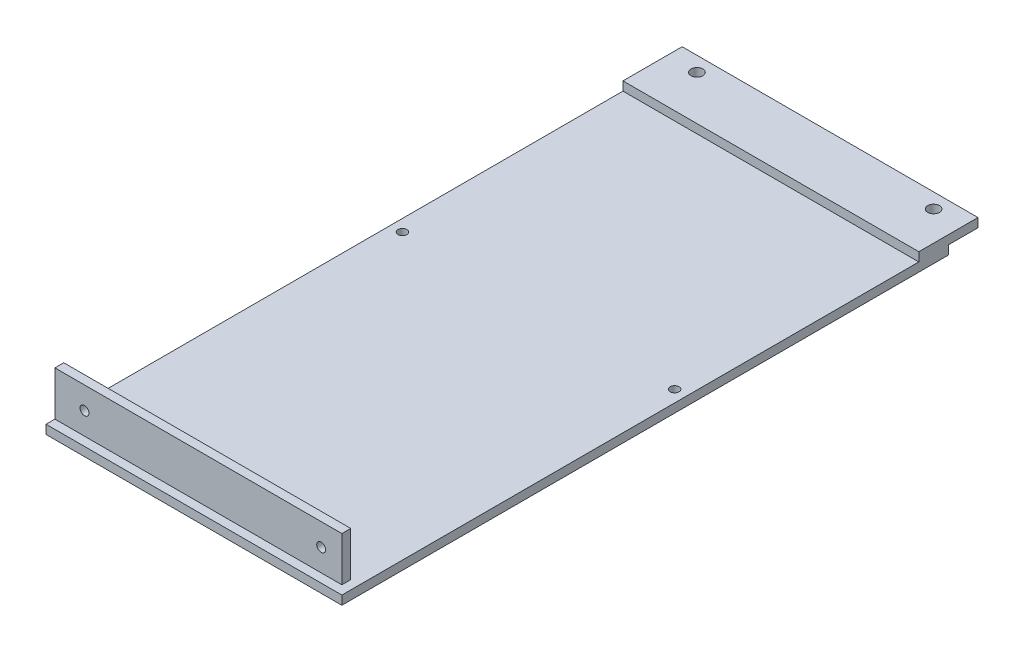
ISO-10303-21;
HEADER;
FILE_DESCRIPTION(('STEP AP214'),'2;1');
FILE_NAME('part.step','',(''),(''),'','','');
FILE_SCHEMA(('AUTOMOTIVE_DESIGN { 1 0 10303 214 1 1 1 1 }'));
ENDSEC;
DATA;
#1=APPLICATION_CONTEXT('core data for automotive mechanical design processes');
#2=APPLICATION_PROTOCOL_DEFINITION('international standard','automotive_design',2000,#1);
#3=PRODUCT_CONTEXT('',#1,'mechanical');
#4=PRODUCT('Part','Part','',(#3));
#5=PRODUCT_RELATED_PRODUCT_CATEGORY('part','',(#4));
#6=PRODUCT_DEFINITION_FORMATION('','',#4);
#7=PRODUCT_DEFINITION_CONTEXT('part definition',#1,'design');
#8=PRODUCT_DEFINITION('design','',#6,#7);
#9=PRODUCT_DEFINITION_SHAPE('','',#8);
#10=(LENGTH_UNIT() NAMED_UNIT(*) SI_UNIT(.MILLI.,.METRE.));
#11=(NAMED_UNIT(*) PLANE_ANGLE_UNIT() SI_UNIT($,.RADIAN.));
#12=(NAMED_UNIT(*) SI_UNIT($,.STERADIAN.) SOLID_ANGLE_UNIT());
#13=UNCERTAINTY_MEASURE_WITH_UNIT(LENGTH_MEASURE(1.E-05),#10,'distance_accuracy_value','');
#14=(GEOMETRIC_REPRESENTATION_CONTEXT(3) GLOBAL_UNCERTAINTY_ASSIGNED_CONTEXT((#13)) GLOBAL_UNIT_ASSIGNED_CONTEXT((#10,
#11,#12)) REPRESENTATION_CONTEXT('',''));
#15=CARTESIAN_POINT('',(0.,0.,0.));
#16=DIRECTION('',(0.,0.,1.));
#17=DIRECTION('',(1.,0.,0.));
#18=AXIS2_PLACEMENT_3D('',#15,#16,#17);
#19=CARTESIAN_POINT('',(-50.,18.,99.5));
#20=DIRECTION('',(0.,0.,-1.));
#21=DIRECTION('',(-1.,0.,0.));
#22=AXIS2_PLACEMENT_3D('',#19,#20,#21);
#23=PLANE('',#22);
#24=CARTESIAN_POINT('',(-40.,10.5,99.5));
#25=DIRECTION('',(0.,0.,1.));
#26=DIRECTION('',(1.,0.,0.));
#27=AXIS2_PLACEMENT_3D('',#24,#25,#26);
#28=CIRCLE('',#27,1.5);
#29=CARTESIAN_POINT('',(-38.5,10.5,99.5));
#30=VERTEX_POINT('',#29);
#31=EDGE_CURVE('E163',#30,#30,#28,.T.);
#32=ORIENTED_EDGE('',*,*,#31,.F.);
#33=EDGE_LOOP('',(#32));
#34=FACE_BOUND('',#33,.T.);
#35=CARTESIAN_POINT('',(40.,10.5,99.5));
#36=DIRECTION('',(0.,0.,1.));
#37=DIRECTION('',(1.,0.,0.));
#38=AXIS2_PLACEMENT_3D('',#35,#36,#37);
#39=CIRCLE('',#38,1.5);
#40=CARTESIAN_POINT('',(41.5,10.5,99.5));
#41=VERTEX_POINT('',#40);
#42=EDGE_CURVE('E559',#41,#41,#39,.T.);
#43=ORIENTED_EDGE('',*,*,#42,.F.);
#44=EDGE_LOOP('',(#43));
#45=FACE_BOUND('',#44,.T.);
#46=DIRECTION('',(0.,-1.,0.));
#47=VECTOR('',#46,1.);
#48=CARTESIAN_POINT('',(47.,18.,99.5));
#49=LINE('',#48,#47);
#50=CARTESIAN_POINT('',(47.,18.,99.5));
#51=VERTEX_POINT('',#50);
#52=CARTESIAN_POINT('',(47.,3.,99.5));
#53=VERTEX_POINT('',#52);
#54=EDGE_CURVE('E143',#51,#53,#49,.T.);
#55=ORIENTED_EDGE('',*,*,#54,.F.);
#56=DIRECTION('',(1.,0.,0.));
#57=VECTOR('',#56,1.);
#58=CARTESIAN_POINT('',(-50.,18.,99.5));
#59=LINE('',#58,#57);
#60=CARTESIAN_POINT('',(-50.,18.,99.5));
#61=VERTEX_POINT('',#60);
#62=EDGE_CURVE('E572',#61,#51,#59,.T.);
#63=ORIENTED_EDGE('',*,*,#62,.F.);
#64=DIRECTION('',(0.,-1.,0.));
#65=VECTOR('',#64,1.);
#66=CARTESIAN_POINT('',(-50.,18.,99.5));
#67=LINE('',#66,#65);
#68=CARTESIAN_POINT('',(-50.,3.,99.5));
#69=VERTEX_POINT('',#68);
#70=EDGE_CURVE('E154',#61,#69,#67,.T.);
#71=ORIENTED_EDGE('',*,*,#70,.T.);
#72=DIRECTION('',(1.,0.,0.));
#73=VECTOR('',#72,1.);
#74=CARTESIAN_POINT('',(-50.,3.,99.5));
#75=LINE('',#74,#73);
#76=EDGE_CURVE('E139',#69,#53,#75,.T.);
#77=ORIENTED_EDGE('',*,*,#76,.T.);
#78=EDGE_LOOP('',(#55,#63,#71,#77));
#79=FACE_BOUND('',#78,.T.);
#80=ADVANCED_FACE('F42',(#34,#45,#79),#23,.F.);
#81=CARTESIAN_POINT('',(-50.,18.,96.5));
#82=DIRECTION('',(0.,0.,1.));
#83=DIRECTION('',(1.,0.,0.));
#84=AXIS2_PLACEMENT_3D('',#81,#82,#83);
#85=PLANE('',#84);
#86=CARTESIAN_POINT('',(-40.,10.5,96.5));
#87=DIRECTION('',(0.,0.,1.));
#88=DIRECTION('',(1.,0.,0.));
#89=AXIS2_PLACEMENT_3D('',#86,#87,#88);
#90=CIRCLE('',#89,1.5);
#91=CARTESIAN_POINT('',(-38.5,10.5,96.5));
#92=VERTEX_POINT('',#91);
#93=EDGE_CURVE('E156',#92,#92,#90,.F.);
#94=ORIENTED_EDGE('',*,*,#93,.F.);
#95=EDGE_LOOP('',(#94));
#96=FACE_BOUND('',#95,.T.);
#97=CARTESIAN_POINT('',(40.,10.5,96.5));
#98=DIRECTION('',(0.,0.,1.));
#99=DIRECTION('',(1.,0.,0.));
#100=AXIS2_PLACEMENT_3D('',#97,#98,#99);
#101=CIRCLE('',#100,1.5);
#102=CARTESIAN_POINT('',(41.5,10.5,96.5));
#103=VERTEX_POINT('',#102);
#104=EDGE_CURVE('E563',#103,#103,#101,.F.);
#105=ORIENTED_EDGE('',*,*,#104,.F.);
#106=EDGE_LOOP('',(#105));
#107=FACE_BOUND('',#106,.T.);
#108=DIRECTION('',(0.,1.,0.));
#109=VECTOR('',#108,1.);
#110=CARTESIAN_POINT('',(47.,18.,96.5));
#111=LINE('',#110,#109);
#112=CARTESIAN_POINT('',(47.,3.,96.5));
#113=VERTEX_POINT('',#112);
#114=CARTESIAN_POINT('',(47.,18.,96.5));
#115=VERTEX_POINT('',#114);
#116=EDGE_CURVE('E58',#113,#115,#111,.T.);
#117=ORIENTED_EDGE('',*,*,#116,.F.);
#118=DIRECTION('',(-1.,0.,0.));
#119=VECTOR('',#118,1.);
#120=CARTESIAN_POINT('',(-50.,3.,96.5));
#121=LINE('',#120,#119);
#122=CARTESIAN_POINT('',(-50.,3.,96.5));
#123=VERTEX_POINT('',#122);
#124=EDGE_CURVE('E141',#113,#123,#121,.T.);
#125=ORIENTED_EDGE('',*,*,#124,.T.);
#126=DIRECTION('',(0.,-1.,0.));
#127=VECTOR('',#126,1.);
#128=CARTESIAN_POINT('',(-50.,18.,96.5));
#129=LINE('',#128,#127);
#130=CARTESIAN_POINT('',(-50.,18.,96.5));
#131=VERTEX_POINT('',#130);
#132=EDGE_CURVE('E169',#131,#123,#129,.T.);
#133=ORIENTED_EDGE('',*,*,#132,.F.);
#134=DIRECTION('',(-1.,0.,0.));
#135=VECTOR('',#134,1.);
#136=CARTESIAN_POINT('',(-50.,18.,96.5));
#137=LINE('',#136,#135);
#138=EDGE_CURVE('E166',#115,#131,#137,.T.);
#139=ORIENTED_EDGE('',*,*,#138,.F.);
#140=EDGE_LOOP('',(#117,#125,#133,#139));
#141=FACE_BOUND('',#140,.T.);
#142=ADVANCED_FACE('F310',(#96,#107,#141),#85,.F.);
#143=CARTESIAN_POINT('',(0.,18.,0.));
#144=DIRECTION('',(0.,-1.,0.));
#145=DIRECTION('',(0.,0.,-1.));
#146=AXIS2_PLACEMENT_3D('',#143,#144,#145);
#147=PLANE('',#146);
#148=DIRECTION('',(0.,0.,1.));
#149=VECTOR('',#148,1.);
#150=CARTESIAN_POINT('',(47.,18.,99.5));
#151=LINE('',#150,#149);
#152=EDGE_CURVE('E147',#115,#51,#151,.T.);
#153=ORIENTED_EDGE('',*,*,#152,.F.);
#154=ORIENTED_EDGE('',*,*,#138,.T.);
#155=DIRECTION('',(0.,0.,1.));
#156=VECTOR('',#155,1.);
#157=CARTESIAN_POINT('',(-50.,18.,99.5));
#158=LINE('',#157,#156);
#159=EDGE_CURVE('E160',#131,#61,#158,.T.);
#160=ORIENTED_EDGE('',*,*,#159,.T.);
#161=ORIENTED_EDGE('',*,*,#62,.T.);
#162=EDGE_LOOP('',(#153,#154,#160,#161));
#163=FACE_BOUND('',#162,.T.);
#164=ADVANCED_FACE('F306',(#163),#147,.F.);
#165=CARTESIAN_POINT('',(0.,3.,0.));
#166=DIRECTION('',(0.,1.,0.));
#167=DIRECTION('',(0.,0.,1.));
#168=AXIS2_PLACEMENT_3D('',#165,#166,#167);
#169=PLANE('',#168);
#170=CARTESIAN_POINT('',(-46.,3.,-13.97));
#171=DIRECTION('',(0.,1.,0.));
#172=DIRECTION('',(0.,0.,1.));
#173=AXIS2_PLACEMENT_3D('',#170,#171,#172);
#174=CIRCLE('',#173,1.5);
#175=CARTESIAN_POINT('',(-46.,3.,-12.47));
#176=VERTEX_POINT('',#175);
#177=EDGE_CURVE('E539',#176,#176,#174,.T.);
#178=ORIENTED_EDGE('',*,*,#177,.F.);
#179=EDGE_LOOP('',(#178));
#180=FACE_BOUND('',#179,.T.);
#181=CARTESIAN_POINT('',(46.,3.,-13.97));
#182=DIRECTION('',(0.,1.,0.));
#183=DIRECTION('',(0.,0.,1.));
#184=AXIS2_PLACEMENT_3D('',#181,#182,#183);
#185=CIRCLE('',#184,1.5);
#186=CARTESIAN_POINT('',(46.,3.,-12.47));
#187=VERTEX_POINT('',#186);
#188=EDGE_CURVE('E545',#187,#187,#185,.T.);
#189=ORIENTED_EDGE('',*,*,#188,.F.);
#190=EDGE_LOOP('',(#189));
#191=FACE_BOUND('',#190,.T.);
#192=DIRECTION('',(0.,0.,-1.));
#193=VECTOR('',#192,1.);
#194=CARTESIAN_POINT('',(-50.,3.,102.5));
#195=LINE('',#194,#193);
#196=CARTESIAN_POINT('',(-50.,3.,-92.4999999999999));
#197=VERTEX_POINT('',#196);
#198=EDGE_CURVE('E66',#123,#197,#195,.T.);
#199=ORIENTED_EDGE('',*,*,#198,.F.);
#200=ORIENTED_EDGE('',*,*,#124,.F.);
#201=DIRECTION('',(0.,0.,-1.));
#202=VECTOR('',#201,1.);
#203=CARTESIAN_POINT('',(47.,3.,99.5));
#204=LINE('',#203,#202);
#205=EDGE_CURVE('E134',#53,#113,#204,.T.);
#206=ORIENTED_EDGE('',*,*,#205,.F.);
#207=ORIENTED_EDGE('',*,*,#76,.F.);
#208=CARTESIAN_POINT('',(-50.,3.,102.5));
#209=VERTEX_POINT('',#208);
#210=EDGE_CURVE('E246',#209,#69,#195,.T.);
#211=ORIENTED_EDGE('',*,*,#210,.F.);
#212=DIRECTION('',(1.,0.,0.));
#213=VECTOR('',#212,1.);
#214=CARTESIAN_POINT('',(-50.,3.,102.5));
#215=LINE('',#214,#213);
#216=CARTESIAN_POINT('',(50.,3.,102.5));
#217=VERTEX_POINT('',#216);
#218=EDGE_CURVE('E234',#209,#217,#215,.T.);
#219=ORIENTED_EDGE('',*,*,#218,.T.);
#220=DIRECTION('',(0.,0.,-1.));
#221=VECTOR('',#220,1.);
#222=CARTESIAN_POINT('',(50.,3.,102.5));
#223=LINE('',#222,#221);
#224=CARTESIAN_POINT('',(50.,3.,-92.5));
#225=VERTEX_POINT('',#224);
#226=EDGE_CURVE('E238',#217,#225,#223,.T.);
#227=ORIENTED_EDGE('',*,*,#226,.T.);
#228=DIRECTION('',(1.,0.,0.));
#229=VECTOR('',#228,1.);
#230=CARTESIAN_POINT('',(-50.,3.,-92.5));
#231=LINE('',#230,#229);
#232=EDGE_CURVE('E209',#197,#225,#231,.T.);
#233=ORIENTED_EDGE('',*,*,#232,.F.);
#234=EDGE_LOOP('',(#199,#200,#206,#207,#211,#219,#227,#233));
#235=FACE_BOUND('',#234,.T.);
#236=ADVANCED_FACE('F136',(#180,#191,#235),#169,.T.);
#237=CARTESIAN_POINT('',(-50.,3.,102.5));
#238=DIRECTION('',(0.,0.,-1.));
#239=DIRECTION('',(-1.,0.,0.));
#240=AXIS2_PLACEMENT_3D('',#237,#238,#239);
#241=PLANE('',#240);
#242=DIRECTION('',(1.,0.,0.));
#243=VECTOR('',#242,1.);
#244=CARTESIAN_POINT('',(-50.,0.,102.5));
#245=LINE('',#244,#243);
#246=CARTESIAN_POINT('',(-50.,0.,102.5));
#247=VERTEX_POINT('',#246);
#248=CARTESIAN_POINT('',(50.,0.,102.5));
#249=VERTEX_POINT('',#248);
#250=EDGE_CURVE('E233',#247,#249,#245,.T.);
#251=ORIENTED_EDGE('',*,*,#250,.T.);
#252=DIRECTION('',(0.,-1.,0.));
#253=VECTOR('',#252,1.);
#254=CARTESIAN_POINT('',(50.,3.,102.5));
#255=LINE('',#254,#253);
#256=EDGE_CURVE('E11',#217,#249,#255,.T.);
#257=ORIENTED_EDGE('',*,*,#256,.F.);
#258=ORIENTED_EDGE('',*,*,#218,.F.);
#259=DIRECTION('',(0.,-1.,0.));
#260=VECTOR('',#259,1.);
#261=CARTESIAN_POINT('',(-50.,3.,102.5));
#262=LINE('',#261,#260);
#263=EDGE_CURVE('E249',#209,#247,#262,.T.);
#264=ORIENTED_EDGE('',*,*,#263,.T.);
#265=EDGE_LOOP('',(#251,#257,#258,#264));
#266=FACE_BOUND('',#265,.T.);
#267=ADVANCED_FACE('F44',(#266),#241,.F.);
#268=CARTESIAN_POINT('',(50.,3.,102.5));
#269=DIRECTION('',(-1.,0.,0.));
#270=DIRECTION('',(0.,0.,1.));
#271=AXIS2_PLACEMENT_3D('',#268,#269,#270);
#272=PLANE('',#271);
#273=DIRECTION('',(0.,-1.,0.));
#274=VECTOR('',#273,1.);
#275=CARTESIAN_POINT('',(50.,6.,-92.5));
#276=LINE('',#275,#274);
#277=CARTESIAN_POINT('',(50.,6.,-92.5));
#278=VERTEX_POINT('',#277);
#279=EDGE_CURVE('E225',#278,#225,#276,.T.);
#280=ORIENTED_EDGE('',*,*,#279,.T.);
#281=ORIENTED_EDGE('',*,*,#226,.F.);
#282=ORIENTED_EDGE('',*,*,#256,.T.);
#283=DIRECTION('',(0.,0.,-1.));
#284=VECTOR('',#283,1.);
#285=CARTESIAN_POINT('',(50.,0.,102.5));
#286=LINE('',#285,#284);
#287=CARTESIAN_POINT('',(50.,0.,-102.5));
#288=VERTEX_POINT('',#287);
#289=EDGE_CURVE('E253',#249,#288,#286,.T.);
#290=ORIENTED_EDGE('',*,*,#289,.T.);
#291=DIRECTION('',(0.,-1.,0.));
#292=VECTOR('',#291,1.);
#293=CARTESIAN_POINT('',(50.,3.,-102.5));
#294=LINE('',#293,#292);
#295=CARTESIAN_POINT('',(50.,3.,-102.5));
#296=VERTEX_POINT('',#295);
#297=EDGE_CURVE('E51',#296,#288,#294,.T.);
#298=ORIENTED_EDGE('',*,*,#297,.F.);
#299=DIRECTION('',(0.,0.,-1.));
#300=VECTOR('',#299,1.);
#301=CARTESIAN_POINT('',(50.,3.,-92.5));
#302=LINE('',#301,#300);
#303=CARTESIAN_POINT('',(50.,3.,-112.5));
#304=VERTEX_POINT('',#303);
#305=EDGE_CURVE('E213',#296,#304,#302,.T.);
#306=ORIENTED_EDGE('',*,*,#305,.T.);
#307=DIRECTION('',(0.,-1.,0.));
#308=VECTOR('',#307,1.);
#309=CARTESIAN_POINT('',(50.,6.,-112.5));
#310=LINE('',#309,#308);
#311=CARTESIAN_POINT('',(50.,6.,-112.5));
#312=VERTEX_POINT('',#311);
#313=EDGE_CURVE('E221',#312,#304,#310,.T.);
#314=ORIENTED_EDGE('',*,*,#313,.F.);
#315=DIRECTION('',(0.,0.,-1.));
#316=VECTOR('',#315,1.);
#317=CARTESIAN_POINT('',(50.,6.,-92.5));
#318=LINE('',#317,#316);
#319=EDGE_CURVE('E199',#278,#312,#318,.T.);
#320=ORIENTED_EDGE('',*,*,#319,.F.);
#321=EDGE_LOOP('',(#280,#281,#282,#290,#298,#306,#314,#320));
#322=FACE_BOUND('',#321,.T.);
#323=ADVANCED_FACE('F275',(#322),#272,.F.);
#324=CARTESIAN_POINT('',(-50.,3.,-102.5));
#325=DIRECTION('',(0.,0.,-1.));
#326=DIRECTION('',(-1.,0.,0.));
#327=AXIS2_PLACEMENT_3D('',#324,#325,#326);
#328=PLANE('',#327);
#329=DIRECTION('',(1.,0.,0.));
#330=VECTOR('',#329,1.);
#331=CARTESIAN_POINT('',(-50.,0.,-102.5));
#332=LINE('',#331,#330);
#333=CARTESIAN_POINT('',(-50.,0.,-102.5));
#334=VERTEX_POINT('',#333);
#335=EDGE_CURVE('E257',#334,#288,#332,.T.);
#336=ORIENTED_EDGE('',*,*,#335,.F.);
#337=DIRECTION('',(0.,-1.,0.));
#338=VECTOR('',#337,1.);
#339=CARTESIAN_POINT('',(-50.,3.,-102.5));
#340=LINE('',#339,#338);
#341=CARTESIAN_POINT('',(-50.,3.,-102.5));
#342=VERTEX_POINT('',#341);
#343=EDGE_CURVE('E266',#342,#334,#340,.T.);
#344=ORIENTED_EDGE('',*,*,#343,.F.);
#345=DIRECTION('',(1.,0.,0.));
#346=VECTOR('',#345,1.);
#347=CARTESIAN_POINT('',(-50.,3.,-102.5));
#348=LINE('',#347,#346);
#349=EDGE_CURVE('E242',#342,#296,#348,.T.);
#350=ORIENTED_EDGE('',*,*,#349,.T.);
#351=ORIENTED_EDGE('',*,*,#297,.T.);
#352=EDGE_LOOP('',(#336,#344,#350,#351));
#353=FACE_BOUND('',#352,.T.);
#354=ADVANCED_FACE('F271',(#353),#328,.T.);
#355=CARTESIAN_POINT('',(-50.,3.,102.5));
#356=DIRECTION('',(-1.,0.,0.));
#357=DIRECTION('',(0.,0.,1.));
#358=AXIS2_PLACEMENT_3D('',#355,#356,#357);
#359=PLANE('',#358);
#360=DIRECTION('',(0.,0.,-1.));
#361=VECTOR('',#360,1.);
#362=CARTESIAN_POINT('',(-50.,0.,102.5));
#363=LINE('',#362,#361);
#364=EDGE_CURVE('E239',#247,#334,#363,.T.);
#365=ORIENTED_EDGE('',*,*,#364,.F.);
#366=ORIENTED_EDGE('',*,*,#263,.F.);
#367=ORIENTED_EDGE('',*,*,#210,.T.);
#368=ORIENTED_EDGE('',*,*,#70,.F.);
#369=ORIENTED_EDGE('',*,*,#159,.F.);
#370=ORIENTED_EDGE('',*,*,#132,.T.);
#371=ORIENTED_EDGE('',*,*,#198,.T.);
#372=DIRECTION('',(0.,-1.,0.));
#373=VECTOR('',#372,1.);
#374=CARTESIAN_POINT('',(-50.,6.,-92.5));
#375=LINE('',#374,#373);
#376=CARTESIAN_POINT('',(-50.,6.,-92.5));
#377=VERTEX_POINT('',#376);
#378=EDGE_CURVE('E229',#377,#197,#375,.T.);
#379=ORIENTED_EDGE('',*,*,#378,.F.);
#380=DIRECTION('',(0.,0.,1.));
#381=VECTOR('',#380,1.);
#382=CARTESIAN_POINT('',(-50.,6.,-92.5));
#383=LINE('',#382,#381);
#384=CARTESIAN_POINT('',(-50.,6.,-112.5));
#385=VERTEX_POINT('',#384);
#386=EDGE_CURVE('E191',#385,#377,#383,.T.);
#387=ORIENTED_EDGE('',*,*,#386,.F.);
#388=DIRECTION('',(0.,-1.,0.));
#389=VECTOR('',#388,1.);
#390=CARTESIAN_POINT('',(-50.,6.,-112.5));
#391=LINE('',#390,#389);
#392=CARTESIAN_POINT('',(-50.,3.,-112.5));
#393=VERTEX_POINT('',#392);
#394=EDGE_CURVE('E205',#385,#393,#391,.T.);
#395=ORIENTED_EDGE('',*,*,#394,.T.);
#396=DIRECTION('',(0.,0.,1.));
#397=VECTOR('',#396,1.);
#398=CARTESIAN_POINT('',(-50.,3.,-92.5));
#399=LINE('',#398,#397);
#400=EDGE_CURVE('E187',#393,#342,#399,.T.);
#401=ORIENTED_EDGE('',*,*,#400,.T.);
#402=ORIENTED_EDGE('',*,*,#343,.T.);
#403=EDGE_LOOP('',(#365,#366,#367,#368,#369,#370,#371,#379,#387,#395,#401,#402));
#404=FACE_BOUND('',#403,.T.);
#405=ADVANCED_FACE('F281',(#404),#359,.T.);
#406=CARTESIAN_POINT('',(0.,0.,0.));
#407=DIRECTION('',(0.,1.,0.));
#408=DIRECTION('',(0.,0.,1.));
#409=AXIS2_PLACEMENT_3D('',#406,#407,#408);
#410=PLANE('',#409);
#411=CARTESIAN_POINT('',(-46.,0.,-13.97));
#412=DIRECTION('',(0.,1.,0.));
#413=DIRECTION('',(0.,0.,1.));
#414=AXIS2_PLACEMENT_3D('',#411,#412,#413);
#415=CIRCLE('',#414,1.5);
#416=CARTESIAN_POINT('',(-46.,0.,-12.47));
#417=VERTEX_POINT('',#416);
#418=EDGE_CURVE('E151',#417,#417,#415,.F.);
#419=ORIENTED_EDGE('',*,*,#418,.F.);
#420=EDGE_LOOP('',(#419));
#421=FACE_BOUND('',#420,.T.);
#422=CARTESIAN_POINT('',(46.,0.,-13.97));
#423=DIRECTION('',(0.,1.,0.));
#424=DIRECTION('',(0.,0.,1.));
#425=AXIS2_PLACEMENT_3D('',#422,#423,#424);
#426=CIRCLE('',#425,1.5);
#427=CARTESIAN_POINT('',(46.,0.,-12.47));
#428=VERTEX_POINT('',#427);
#429=EDGE_CURVE('E548',#428,#428,#426,.F.);
#430=ORIENTED_EDGE('',*,*,#429,.F.);
#431=EDGE_LOOP('',(#430));
#432=FACE_BOUND('',#431,.T.);
#433=ORIENTED_EDGE('',*,*,#250,.F.);
#434=ORIENTED_EDGE('',*,*,#364,.T.);
#435=ORIENTED_EDGE('',*,*,#335,.T.);
#436=ORIENTED_EDGE('',*,*,#289,.F.);
#437=EDGE_LOOP('',(#433,#434,#435,#436));
#438=FACE_BOUND('',#437,.T.);
#439=ADVANCED_FACE('F279',(#421,#432,#438),#410,.F.);
#440=CARTESIAN_POINT('',(0.,3.,0.));
#441=DIRECTION('',(0.,-1.,0.));
#442=DIRECTION('',(0.,0.,-1.));
#443=AXIS2_PLACEMENT_3D('',#440,#441,#442);
#444=PLANE('',#443);
#445=CARTESIAN_POINT('',(40.,3.,-107.5));
#446=DIRECTION('',(0.,-1.,0.));
#447=DIRECTION('',(0.,0.,-1.));
#448=AXIS2_PLACEMENT_3D('',#445,#446,#447);
#449=CIRCLE('',#448,2.);
#450=CARTESIAN_POINT('',(40.,3.,-105.5));
#451=VERTEX_POINT('',#450);
#452=EDGE_CURVE('E174',#451,#451,#449,.F.);
#453=ORIENTED_EDGE('',*,*,#452,.T.);
#454=EDGE_LOOP('',(#453));
#455=FACE_BOUND('',#454,.T.);
#456=CARTESIAN_POINT('',(-40.,3.,-107.5));
#457=DIRECTION('',(0.,-1.,0.));
#458=DIRECTION('',(0.,0.,-1.));
#459=AXIS2_PLACEMENT_3D('',#456,#457,#458);
#460=CIRCLE('',#459,2.);
#461=CARTESIAN_POINT('',(-40.,3.,-105.5));
#462=VERTEX_POINT('',#461);
#463=EDGE_CURVE('E179',#462,#462,#460,.F.);
#464=ORIENTED_EDGE('',*,*,#463,.T.);
#465=EDGE_LOOP('',(#464));
#466=FACE_BOUND('',#465,.T.);
#467=ORIENTED_EDGE('',*,*,#349,.F.);
#468=ORIENTED_EDGE('',*,*,#400,.F.);
#469=DIRECTION('',(-1.,0.,0.));
#470=VECTOR('',#469,1.);
#471=CARTESIAN_POINT('',(-50.,3.,-112.5));
#472=LINE('',#471,#470);
#473=EDGE_CURVE('E196',#304,#393,#472,.T.);
#474=ORIENTED_EDGE('',*,*,#473,.F.);
#475=ORIENTED_EDGE('',*,*,#305,.F.);
#476=EDGE_LOOP('',(#467,#468,#474,#475));
#477=FACE_BOUND('',#476,.T.);
#478=ADVANCED_FACE('F285',(#455,#466,#477),#444,.T.);
#479=CARTESIAN_POINT('',(-50.,6.,-92.5));
#480=DIRECTION('',(0.,0.,-1.));
#481=DIRECTION('',(-1.,0.,0.));
#482=AXIS2_PLACEMENT_3D('',#479,#480,#481);
#483=PLANE('',#482);
#484=ORIENTED_EDGE('',*,*,#232,.T.);
#485=ORIENTED_EDGE('',*,*,#279,.F.);
#486=DIRECTION('',(1.,0.,0.));
#487=VECTOR('',#486,1.);
#488=CARTESIAN_POINT('',(-50.,6.,-92.5));
#489=LINE('',#488,#487);
#490=EDGE_CURVE('E195',#377,#278,#489,.T.);
#491=ORIENTED_EDGE('',*,*,#490,.F.);
#492=ORIENTED_EDGE('',*,*,#378,.T.);
#493=EDGE_LOOP('',(#484,#485,#491,#492));
#494=FACE_BOUND('',#493,.T.);
#495=ADVANCED_FACE('F298',(#494),#483,.F.);
#496=CARTESIAN_POINT('',(-50.,6.,-112.5));
#497=DIRECTION('',(0.,0.,1.));
#498=DIRECTION('',(1.,0.,0.));
#499=AXIS2_PLACEMENT_3D('',#496,#497,#498);
#500=PLANE('',#499);
#501=ORIENTED_EDGE('',*,*,#473,.T.);
#502=ORIENTED_EDGE('',*,*,#394,.F.);
#503=DIRECTION('',(-1.,0.,0.));
#504=VECTOR('',#503,1.);
#505=CARTESIAN_POINT('',(-50.,6.,-112.5));
#506=LINE('',#505,#504);
#507=EDGE_CURVE('E202',#312,#385,#506,.T.);
#508=ORIENTED_EDGE('',*,*,#507,.F.);
#509=ORIENTED_EDGE('',*,*,#313,.T.);
#510=EDGE_LOOP('',(#501,#502,#508,#509));
#511=FACE_BOUND('',#510,.T.);
#512=ADVANCED_FACE('F291',(#511),#500,.F.);
#513=CARTESIAN_POINT('',(0.,6.,0.));
#514=DIRECTION('',(0.,-1.,0.));
#515=DIRECTION('',(0.,0.,-1.));
#516=AXIS2_PLACEMENT_3D('',#513,#514,#515);
#517=PLANE('',#516);
#518=CARTESIAN_POINT('',(40.,6.,-107.5));
#519=DIRECTION('',(0.,1.,0.));
#520=DIRECTION('',(0.,0.,1.));
#521=AXIS2_PLACEMENT_3D('',#518,#519,#520);
#522=CIRCLE('',#521,2.);
#523=CARTESIAN_POINT('',(40.,6.,-105.5));
#524=VERTEX_POINT('',#523);
#525=EDGE_CURVE('E175',#524,#524,#522,.T.);
#526=ORIENTED_EDGE('',*,*,#525,.F.);
#527=EDGE_LOOP('',(#526));
#528=FACE_BOUND('',#527,.T.);
#529=CARTESIAN_POINT('',(-40.,6.,-107.5));
#530=DIRECTION('',(0.,1.,0.));
#531=DIRECTION('',(0.,0.,1.));
#532=AXIS2_PLACEMENT_3D('',#529,#530,#531);
#533=CIRCLE('',#532,2.);
#534=CARTESIAN_POINT('',(-40.,6.,-105.5));
#535=VERTEX_POINT('',#534);
#536=EDGE_CURVE('E183',#535,#535,#533,.T.);
#537=ORIENTED_EDGE('',*,*,#536,.F.);
#538=EDGE_LOOP('',(#537));
#539=FACE_BOUND('',#538,.T.);
#540=ORIENTED_EDGE('',*,*,#386,.T.);
#541=ORIENTED_EDGE('',*,*,#490,.T.);
#542=ORIENTED_EDGE('',*,*,#319,.T.);
#543=ORIENTED_EDGE('',*,*,#507,.T.);
#544=EDGE_LOOP('',(#540,#541,#542,#543));
#545=FACE_BOUND('',#544,.T.);
#546=ADVANCED_FACE('F295',(#528,#539,#545),#517,.F.);
#547=CARTESIAN_POINT('',(-40.,-0.00100000000000013,-107.5));
#548=DIRECTION('',(0.,1.,0.));
#549=DIRECTION('',(0.,0.,1.));
#550=AXIS2_PLACEMENT_3D('',#547,#548,#549);
#551=CYLINDRICAL_SURFACE('',#550,2.);
#552=CARTESIAN_POINT('',(-40.,3.,-105.5));
#553=CARTESIAN_POINT('',(-40.,3.03125,-105.5));
#554=CARTESIAN_POINT('',(-40.,3.0625,-105.5));
#555=CARTESIAN_POINT('',(-40.,3.125,-105.5));
#556=CARTESIAN_POINT('',(-40.,3.15625,-105.5));
#557=CARTESIAN_POINT('',(-40.,3.21875,-105.5));
#558=CARTESIAN_POINT('',(-40.,3.25,-105.5));
#559=CARTESIAN_POINT('',(-40.,3.3125,-105.5));
#560=CARTESIAN_POINT('',(-40.,3.34375,-105.5));
#561=CARTESIAN_POINT('',(-40.,3.40625,-105.5));
#562=CARTESIAN_POINT('',(-40.,3.4375,-105.5));
#563=CARTESIAN_POINT('',(-40.,3.5,-105.5));
#564=CARTESIAN_POINT('',(-40.,3.53125,-105.5));
#565=CARTESIAN_POINT('',(-40.,3.59375,-105.5));
#566=CARTESIAN_POINT('',(-40.,3.625,-105.5));
#567=CARTESIAN_POINT('',(-40.,3.6875,-105.5));
#568=CARTESIAN_POINT('',(-40.,3.71875,-105.5));
#569=CARTESIAN_POINT('',(-40.,3.78125,-105.5));
#570=CARTESIAN_POINT('',(-40.,3.8125,-105.5));
#571=CARTESIAN_POINT('',(-40.,3.875,-105.5));
#572=CARTESIAN_POINT('',(-40.,3.90625,-105.5));
#573=CARTESIAN_POINT('',(-40.,3.96875,-105.5));
#574=CARTESIAN_POINT('',(-40.,4.,-105.5));
#575=CARTESIAN_POINT('',(-40.,4.0625,-105.5));
#576=CARTESIAN_POINT('',(-40.,4.09375,-105.5));
#577=CARTESIAN_POINT('',(-40.,4.15625,-105.5));
#578=CARTESIAN_POINT('',(-40.,4.1875,-105.5));
#579=CARTESIAN_POINT('',(-40.,4.25,-105.5));
#580=CARTESIAN_POINT('',(-40.,4.28125,-105.5));
#581=CARTESIAN_POINT('',(-40.,4.34375,-105.5));
#582=CARTESIAN_POINT('',(-40.,4.375,-105.5));
#583=CARTESIAN_POINT('',(-40.,4.4375,-105.5));
#584=CARTESIAN_POINT('',(-40.,4.46875,-105.5));
#585=CARTESIAN_POINT('',(-40.,4.53125,-105.5));
#586=CARTESIAN_POINT('',(-40.,4.5625,-105.5));
#587=CARTESIAN_POINT('',(-40.,4.625,-105.5));
#588=CARTESIAN_POINT('',(-40.,4.65625,-105.5));
#589=CARTESIAN_POINT('',(-40.,4.71875,-105.5));
#590=CARTESIAN_POINT('',(-40.,4.75,-105.5));
#591=CARTESIAN_POINT('',(-40.,4.8125,-105.5));
#592=CARTESIAN_POINT('',(-40.,4.84375,-105.5));
#593=CARTESIAN_POINT('',(-40.,4.90625,-105.5));
#594=CARTESIAN_POINT('',(-40.,4.9375,-105.5));
#595=CARTESIAN_POINT('',(-40.,5.,-105.5));
#596=CARTESIAN_POINT('',(-40.,5.03125,-105.5));
#597=CARTESIAN_POINT('',(-40.,5.09375,-105.5));
#598=CARTESIAN_POINT('',(-40.,5.125,-105.5));
#599=CARTESIAN_POINT('',(-40.,5.1875,-105.5));
#600=CARTESIAN_POINT('',(-40.,5.21875,-105.5));
#601=CARTESIAN_POINT('',(-40.,5.28125,-105.5));
#602=CARTESIAN_POINT('',(-40.,5.3125,-105.5));
#603=CARTESIAN_POINT('',(-40.,5.375,-105.5));
#604=CARTESIAN_POINT('',(-40.,5.40625,-105.5));
#605=CARTESIAN_POINT('',(-40.,5.46875,-105.5));
#606=CARTESIAN_POINT('',(-40.,5.5,-105.5));
#607=CARTESIAN_POINT('',(-40.,5.5625,-105.5));
#608=CARTESIAN_POINT('',(-40.,5.59375,-105.5));
#609=CARTESIAN_POINT('',(-40.,5.65625,-105.5));
#610=CARTESIAN_POINT('',(-40.,5.6875,-105.5));
#611=CARTESIAN_POINT('',(-40.,5.75,-105.5));
#612=CARTESIAN_POINT('',(-40.,5.78125,-105.5));
#613=CARTESIAN_POINT('',(-40.,5.84375,-105.5));
#614=CARTESIAN_POINT('',(-40.,5.875,-105.5));
#615=CARTESIAN_POINT('',(-40.,5.9375,-105.5));
#616=CARTESIAN_POINT('',(-40.,5.96875,-105.5));
#617=CARTESIAN_POINT('',(-40.,6.,-105.5));
#618=B_SPLINE_CURVE_WITH_KNOTS('',3,(#552,#553,#554,#555,#556,#557,#558,#559,#560,#561,#562,
#563,#564,#565,#566,#567,#568,#569,#570,#571,#572,#573,#574,#575,#576,#577,#578,#579,#580,#581,
#582,#583,#584,#585,#586,#587,#588,#589,#590,#591,#592,#593,#594,#595,#596,#597,#598,#599,#600,
#601,#602,#603,#604,#605,#606,#607,#608,#609,#610,#611,#612,#613,#614,#615,#616,#617),
.UNSPECIFIED.,.F.,.F.,(4,2,2,2,2,2,2,2,2,2,2,2,2,2,2,2,2,2,2,2,2,2,2,2,2,2,2,2,2,2,2,2,4),(0.,
0.0937500000000001,0.1875,0.28125,0.375,0.46875,0.5625,0.65625,0.75,0.84375,0.9375,1.03125,
1.125,1.21875,1.3125,1.40625,1.5,1.59375,1.6875,1.78125,1.875,1.96875,2.0625,2.15625,2.25,
2.34375,2.4375,2.53125,2.625,2.71875,2.8125,2.90625,3.),.UNSPECIFIED.);
#619=EDGE_CURVE('BSEAM327',#462,#535,#618,.T.);
#620=ORIENTED_EDGE('',*,*,#463,.F.);
#621=ORIENTED_EDGE('',*,*,#536,.T.);
#622=ORIENTED_EDGE('',*,*,#619,.T.);
#623=ORIENTED_EDGE('',*,*,#619,.F.);
#624=EDGE_LOOP('',(#620,#622,#621,#623));
#625=FACE_BOUND('',#624,.T.);
#626=ADVANCED_FACE('F327',(#625),#551,.F.);
#627=CARTESIAN_POINT('',(40.,-0.00100000000000013,-107.5));
#628=DIRECTION('',(0.,1.,0.));
#629=DIRECTION('',(0.,0.,1.));
#630=AXIS2_PLACEMENT_3D('',#627,#628,#629);
#631=CYLINDRICAL_SURFACE('',#630,2.);
#632=CARTESIAN_POINT('',(40.,3.,-105.5));
#633=CARTESIAN_POINT('',(40.,3.03125,-105.5));
#634=CARTESIAN_POINT('',(40.,3.0625,-105.5));
#635=CARTESIAN_POINT('',(40.,3.125,-105.5));
#636=CARTESIAN_POINT('',(40.,3.15625,-105.5));
#637=CARTESIAN_POINT('',(40.,3.21875,-105.5));
#638=CARTESIAN_POINT('',(40.,3.25,-105.5));
#639=CARTESIAN_POINT('',(40.,3.3125,-105.5));
#640=CARTESIAN_POINT('',(40.,3.34375,-105.5));
#641=CARTESIAN_POINT('',(40.,3.40625,-105.5));
#642=CARTESIAN_POINT('',(40.,3.4375,-105.5));
#643=CARTESIAN_POINT('',(40.,3.5,-105.5));
#644=CARTESIAN_POINT('',(40.,3.53125,-105.5));
#645=CARTESIAN_POINT('',(40.,3.59375,-105.5));
#646=CARTESIAN_POINT('',(40.,3.625,-105.5));
#647=CARTESIAN_POINT('',(40.,3.6875,-105.5));
#648=CARTESIAN_POINT('',(40.,3.71875,-105.5));
#649=CARTESIAN_POINT('',(40.,3.78125,-105.5));
#650=CARTESIAN_POINT('',(40.,3.8125,-105.5));
#651=CARTESIAN_POINT('',(40.,3.875,-105.5));
#652=CARTESIAN_POINT('',(40.,3.90625,-105.5));
#653=CARTESIAN_POINT('',(40.,3.96875,-105.5));
#654=CARTESIAN_POINT('',(40.,4.,-105.5));
#655=CARTESIAN_POINT('',(40.,4.0625,-105.5));
#656=CARTESIAN_POINT('',(40.,4.09375,-105.5));
#657=CARTESIAN_POINT('',(40.,4.15625,-105.5));
#658=CARTESIAN_POINT('',(40.,4.1875,-105.5));
#659=CARTESIAN_POINT('',(40.,4.25,-105.5));
#660=CARTESIAN_POINT('',(40.,4.28125,-105.5));
#661=CARTESIAN_POINT('',(40.,4.34375,-105.5));
#662=CARTESIAN_POINT('',(40.,4.375,-105.5));
#663=CARTESIAN_POINT('',(40.,4.4375,-105.5));
#664=CARTESIAN_POINT('',(40.,4.46875,-105.5));
#665=CARTESIAN_POINT('',(40.,4.53125,-105.5));
#666=CARTESIAN_POINT('',(40.,4.5625,-105.5));
#667=CARTESIAN_POINT('',(40.,4.625,-105.5));
#668=CARTESIAN_POINT('',(40.,4.65625,-105.5));
#669=CARTESIAN_POINT('',(40.,4.71875,-105.5));
#670=CARTESIAN_POINT('',(40.,4.75,-105.5));
#671=CARTESIAN_POINT('',(40.,4.8125,-105.5));
#672=CARTESIAN_POINT('',(40.,4.84375,-105.5));
#673=CARTESIAN_POINT('',(40.,4.90625,-105.5));
#674=CARTESIAN_POINT('',(40.,4.9375,-105.5));
#675=CARTESIAN_POINT('',(40.,5.,-105.5));
#676=CARTESIAN_POINT('',(40.,5.03125,-105.5));
#677=CARTESIAN_POINT('',(40.,5.09375,-105.5));
#678=CARTESIAN_POINT('',(40.,5.125,-105.5));
#679=CARTESIAN_POINT('',(40.,5.1875,-105.5));
#680=CARTESIAN_POINT('',(40.,5.21875,-105.5));
#681=CARTESIAN_POINT('',(40.,5.28125,-105.5));
#682=CARTESIAN_POINT('',(40.,5.3125,-105.5));
#683=CARTESIAN_POINT('',(40.,5.375,-105.5));
#684=CARTESIAN_POINT('',(40.,5.40625,-105.5));
#685=CARTESIAN_POINT('',(40.,5.46875,-105.5));
#686=CARTESIAN_POINT('',(40.,5.5,-105.5));
#687=CARTESIAN_POINT('',(40.,5.5625,-105.5));
#688=CARTESIAN_POINT('',(40.,5.59375,-105.5));
#689=CARTESIAN_POINT('',(40.,5.65625,-105.5));
#690=CARTESIAN_POINT('',(40.,5.6875,-105.5));
#691=CARTESIAN_POINT('',(40.,5.75,-105.5));
#692=CARTESIAN_POINT('',(40.,5.78125,-105.5));
#693=CARTESIAN_POINT('',(40.,5.84375,-105.5));
#694=CARTESIAN_POINT('',(40.,5.875,-105.5));
#695=CARTESIAN_POINT('',(40.,5.9375,-105.5));
#696=CARTESIAN_POINT('',(40.,5.96875,-105.5));
#697=CARTESIAN_POINT('',(40.,6.,-105.5));
#698=B_SPLINE_CURVE_WITH_KNOTS('',3,(#632,#633,#634,#635,#636,#637,#638,#639,#640,#641,#642,
#643,#644,#645,#646,#647,#648,#649,#650,#651,#652,#653,#654,#655,#656,#657,#658,#659,#660,#661,
#662,#663,#664,#665,#666,#667,#668,#669,#670,#671,#672,#673,#674,#675,#676,#677,#678,#679,#680,
#681,#682,#683,#684,#685,#686,#687,#688,#689,#690,#691,#692,#693,#694,#695,#696,#697),
.UNSPECIFIED.,.F.,.F.,(4,2,2,2,2,2,2,2,2,2,2,2,2,2,2,2,2,2,2,2,2,2,2,2,2,2,2,2,2,2,2,2,4),(0.,
0.0937500000000001,0.1875,0.28125,0.375,0.46875,0.5625,0.65625,0.75,0.84375,0.9375,1.03125,
1.125,1.21875,1.3125,1.40625,1.5,1.59375,1.6875,1.78125,1.875,1.96875,2.0625,2.15625,2.25,
2.34375,2.4375,2.53125,2.625,2.71875,2.8125,2.90625,3.),.UNSPECIFIED.);
#699=EDGE_CURVE('BSEAM323',#451,#524,#698,.T.);
#700=ORIENTED_EDGE('',*,*,#452,.F.);
#701=ORIENTED_EDGE('',*,*,#525,.T.);
#702=ORIENTED_EDGE('',*,*,#699,.T.);
#703=ORIENTED_EDGE('',*,*,#699,.F.);
#704=EDGE_LOOP('',(#700,#702,#701,#703));
#705=FACE_BOUND('',#704,.T.);
#706=ADVANCED_FACE('F323',(#705),#631,.F.);
#707=CARTESIAN_POINT('',(-40.,10.5,-112.501));
#708=DIRECTION('',(0.,0.,1.));
#709=DIRECTION('',(1.,0.,0.));
#710=AXIS2_PLACEMENT_3D('',#707,#708,#709);
#711=CYLINDRICAL_SURFACE('',#710,1.5);
#712=ORIENTED_EDGE('',*,*,#31,.T.);
#713=EDGE_LOOP('',(#712));
#714=FACE_BOUND('',#713,.T.);
#715=ORIENTED_EDGE('',*,*,#93,.T.);
#716=EDGE_LOOP('',(#715));
#717=FACE_BOUND('',#716,.T.);
#718=ADVANCED_FACE('F326',(#714,#717),#711,.F.);
#719=CARTESIAN_POINT('',(40.,10.5,-112.501));
#720=DIRECTION('',(0.,0.,1.));
#721=DIRECTION('',(1.,0.,0.));
#722=AXIS2_PLACEMENT_3D('',#719,#720,#721);
#723=CYLINDRICAL_SURFACE('',#722,1.5);
#724=ORIENTED_EDGE('',*,*,#42,.T.);
#725=EDGE_LOOP('',(#724));
#726=FACE_BOUND('',#725,.T.);
#727=ORIENTED_EDGE('',*,*,#104,.T.);
#728=EDGE_LOOP('',(#727));
#729=FACE_BOUND('',#728,.T.);
#730=ADVANCED_FACE('F402',(#726,#729),#723,.F.);
#731=CARTESIAN_POINT('',(47.,0.,0.));
#732=DIRECTION('',(1.,0.,0.));
#733=DIRECTION('',(0.,0.,-1.));
#734=AXIS2_PLACEMENT_3D('',#731,#732,#733);
#735=PLANE('',#734);
#736=ORIENTED_EDGE('',*,*,#54,.T.);
#737=ORIENTED_EDGE('',*,*,#205,.T.);
#738=ORIENTED_EDGE('',*,*,#116,.T.);
#739=ORIENTED_EDGE('',*,*,#152,.T.);
#740=EDGE_LOOP('',(#736,#737,#738,#739));
#741=FACE_BOUND('',#740,.T.);
#742=ADVANCED_FACE('F146',(#741),#735,.T.);
#743=CARTESIAN_POINT('',(46.,-0.00100000000000013,-13.97));
#744=DIRECTION('',(0.,1.,0.));
#745=DIRECTION('',(0.,0.,1.));
#746=AXIS2_PLACEMENT_3D('',#743,#744,#745);
#747=CYLINDRICAL_SURFACE('',#746,1.5);
#748=CARTESIAN_POINT('',(46.,3.,-12.47));
#749=CARTESIAN_POINT('',(46.,2.96875,-12.47));
#750=CARTESIAN_POINT('',(46.,2.9375,-12.47));
#751=CARTESIAN_POINT('',(46.,2.875,-12.47));
#752=CARTESIAN_POINT('',(46.,2.84375,-12.47));
#753=CARTESIAN_POINT('',(46.,2.78125,-12.47));
#754=CARTESIAN_POINT('',(46.,2.75,-12.47));
#755=CARTESIAN_POINT('',(46.,2.6875,-12.47));
#756=CARTESIAN_POINT('',(46.,2.65625,-12.47));
#757=CARTESIAN_POINT('',(46.,2.59375,-12.47));
#758=CARTESIAN_POINT('',(46.,2.5625,-12.47));
#759=CARTESIAN_POINT('',(46.,2.5,-12.47));
#760=CARTESIAN_POINT('',(46.,2.46875,-12.47));
#761=CARTESIAN_POINT('',(46.,2.40625,-12.47));
#762=CARTESIAN_POINT('',(46.,2.375,-12.47));
#763=CARTESIAN_POINT('',(46.,2.3125,-12.47));
#764=CARTESIAN_POINT('',(46.,2.28125,-12.47));
#765=CARTESIAN_POINT('',(46.,2.21875,-12.47));
#766=CARTESIAN_POINT('',(46.,2.1875,-12.47));
#767=CARTESIAN_POINT('',(46.,2.125,-12.47));
#768=CARTESIAN_POINT('',(46.,2.09375,-12.47));
#769=CARTESIAN_POINT('',(46.,2.03125,-12.47));
#770=CARTESIAN_POINT('',(46.,2.,-12.47));
#771=CARTESIAN_POINT('',(46.,1.9375,-12.47));
#772=CARTESIAN_POINT('',(46.,1.90625,-12.47));
#773=CARTESIAN_POINT('',(46.,1.84375,-12.47));
#774=CARTESIAN_POINT('',(46.,1.8125,-12.47));
#775=CARTESIAN_POINT('',(46.,1.75,-12.47));
#776=CARTESIAN_POINT('',(46.,1.71875,-12.47));
#777=CARTESIAN_POINT('',(46.,1.65625,-12.47));
#778=CARTESIAN_POINT('',(46.,1.625,-12.47));
#779=CARTESIAN_POINT('',(46.,1.5625,-12.47));
#780=CARTESIAN_POINT('',(46.,1.53125,-12.47));
#781=CARTESIAN_POINT('',(46.,1.46875,-12.47));
#782=CARTESIAN_POINT('',(46.,1.4375,-12.47));
#783=CARTESIAN_POINT('',(46.,1.375,-12.47));
#784=CARTESIAN_POINT('',(46.,1.34375,-12.47));
#785=CARTESIAN_POINT('',(46.,1.28125,-12.47));
#786=CARTESIAN_POINT('',(46.,1.25,-12.47));
#787=CARTESIAN_POINT('',(46.,1.1875,-12.47));
#788=CARTESIAN_POINT('',(46.,1.15625,-12.47));
#789=CARTESIAN_POINT('',(46.,1.09375,-12.47));
#790=CARTESIAN_POINT('',(46.,1.0625,-12.47));
#791=CARTESIAN_POINT('',(46.,1.,-12.47));
#792=CARTESIAN_POINT('',(46.,0.96875,-12.47));
#793=CARTESIAN_POINT('',(46.,0.90625,-12.47));
#794=CARTESIAN_POINT('',(46.,0.875,-12.47));
#795=CARTESIAN_POINT('',(46.,0.8125,-12.47));
#796=CARTESIAN_POINT('',(46.,0.78125,-12.47));
#797=CARTESIAN_POINT('',(46.,0.71875,-12.47));
#798=CARTESIAN_POINT('',(46.,0.6875,-12.47));
#799=CARTESIAN_POINT('',(46.,0.625,-12.47));
#800=CARTESIAN_POINT('',(46.,0.59375,-12.47));
#801=CARTESIAN_POINT('',(46.,0.53125,-12.47));
#802=CARTESIAN_POINT('',(46.,0.5,-12.47));
#803=CARTESIAN_POINT('',(46.,0.4375,-12.47));
#804=CARTESIAN_POINT('',(46.,0.40625,-12.47));
#805=CARTESIAN_POINT('',(46.,0.34375,-12.47));
#806=CARTESIAN_POINT('',(46.,0.3125,-12.47));
#807=CARTESIAN_POINT('',(46.,0.25,-12.47));
#808=CARTESIAN_POINT('',(46.,0.21875,-12.47));
#809=CARTESIAN_POINT('',(46.,0.15625,-12.47));
#810=CARTESIAN_POINT('',(46.,0.125,-12.47));
#811=CARTESIAN_POINT('',(46.,0.0625000000000001,-12.47));
#812=CARTESIAN_POINT('',(46.,0.0312500000000001,-12.47));
#813=CARTESIAN_POINT('',(46.,0.,-12.47));
#814=B_SPLINE_CURVE_WITH_KNOTS('',3,(#748,#749,#750,#751,#752,#753,#754,#755,#756,#757,#758,
#759,#760,#761,#762,#763,#764,#765,#766,#767,#768,#769,#770,#771,#772,#773,#774,#775,#776,#777,
#778,#779,#780,#781,#782,#783,#784,#785,#786,#787,#788,#789,#790,#791,#792,#793,#794,#795,#796,
#797,#798,#799,#800,#801,#802,#803,#804,#805,#806,#807,#808,#809,#810,#811,#812,#813),
.UNSPECIFIED.,.F.,.F.,(4,2,2,2,2,2,2,2,2,2,2,2,2,2,2,2,2,2,2,2,2,2,2,2,2,2,2,2,2,2,2,2,4),(0.,
0.0937500000000001,0.1875,0.28125,0.375,0.46875,0.5625,0.65625,0.75,0.84375,0.9375,1.03125,
1.125,1.21875,1.3125,1.40625,1.5,1.59375,1.6875,1.78125,1.875,1.96875,2.0625,2.15625,2.25,
2.34375,2.4375,2.53125,2.625,2.71875,2.8125,2.90625,3.),.UNSPECIFIED.);
#815=EDGE_CURVE('BSEAM441',#187,#428,#814,.T.);
#816=ORIENTED_EDGE('',*,*,#188,.T.);
#817=ORIENTED_EDGE('',*,*,#429,.T.);
#818=ORIENTED_EDGE('',*,*,#815,.T.);
#819=ORIENTED_EDGE('',*,*,#815,.F.);
#820=EDGE_LOOP('',(#816,#818,#817,#819));
#821=FACE_BOUND('',#820,.T.);
#822=ADVANCED_FACE('F441',(#821),#747,.F.);
#823=CARTESIAN_POINT('',(-46.,-0.00100000000000013,-13.97));
#824=DIRECTION('',(0.,1.,0.));
#825=DIRECTION('',(0.,0.,1.));
#826=AXIS2_PLACEMENT_3D('',#823,#824,#825);
#827=CYLINDRICAL_SURFACE('',#826,1.5);
#828=CARTESIAN_POINT('',(-46.,3.,-12.47));
#829=CARTESIAN_POINT('',(-46.,2.96875,-12.47));
#830=CARTESIAN_POINT('',(-46.,2.9375,-12.47));
#831=CARTESIAN_POINT('',(-46.,2.875,-12.47));
#832=CARTESIAN_POINT('',(-46.,2.84375,-12.47));
#833=CARTESIAN_POINT('',(-46.,2.78125,-12.47));
#834=CARTESIAN_POINT('',(-46.,2.75,-12.47));
#835=CARTESIAN_POINT('',(-46.,2.6875,-12.47));
#836=CARTESIAN_POINT('',(-46.,2.65625,-12.47));
#837=CARTESIAN_POINT('',(-46.,2.59375,-12.47));
#838=CARTESIAN_POINT('',(-46.,2.5625,-12.47));
#839=CARTESIAN_POINT('',(-46.,2.5,-12.47));
#840=CARTESIAN_POINT('',(-46.,2.46875,-12.47));
#841=CARTESIAN_POINT('',(-46.,2.40625,-12.47));
#842=CARTESIAN_POINT('',(-46.,2.375,-12.47));
#843=CARTESIAN_POINT('',(-46.,2.3125,-12.47));
#844=CARTESIAN_POINT('',(-46.,2.28125,-12.47));
#845=CARTESIAN_POINT('',(-46.,2.21875,-12.47));
#846=CARTESIAN_POINT('',(-46.,2.1875,-12.47));
#847=CARTESIAN_POINT('',(-46.,2.125,-12.47));
#848=CARTESIAN_POINT('',(-46.,2.09375,-12.47));
#849=CARTESIAN_POINT('',(-46.,2.03125,-12.47));
#850=CARTESIAN_POINT('',(-46.,2.,-12.47));
#851=CARTESIAN_POINT('',(-46.,1.9375,-12.47));
#852=CARTESIAN_POINT('',(-46.,1.90625,-12.47));
#853=CARTESIAN_POINT('',(-46.,1.84375,-12.47));
#854=CARTESIAN_POINT('',(-46.,1.8125,-12.47));
#855=CARTESIAN_POINT('',(-46.,1.75,-12.47));
#856=CARTESIAN_POINT('',(-46.,1.71875,-12.47));
#857=CARTESIAN_POINT('',(-46.,1.65625,-12.47));
#858=CARTESIAN_POINT('',(-46.,1.625,-12.47));
#859=CARTESIAN_POINT('',(-46.,1.5625,-12.47));
#860=CARTESIAN_POINT('',(-46.,1.53125,-12.47));
#861=CARTESIAN_POINT('',(-46.,1.46875,-12.47));
#862=CARTESIAN_POINT('',(-46.,1.4375,-12.47));
#863=CARTESIAN_POINT('',(-46.,1.375,-12.47));
#864=CARTESIAN_POINT('',(-46.,1.34375,-12.47));
#865=CARTESIAN_POINT('',(-46.,1.28125,-12.47));
#866=CARTESIAN_POINT('',(-46.,1.25,-12.47));
#867=CARTESIAN_POINT('',(-46.,1.1875,-12.47));
#868=CARTESIAN_POINT('',(-46.,1.15625,-12.47));
#869=CARTESIAN_POINT('',(-46.,1.09375,-12.47));
#870=CARTESIAN_POINT('',(-46.,1.0625,-12.47));
#871=CARTESIAN_POINT('',(-46.,1.,-12.47));
#872=CARTESIAN_POINT('',(-46.,0.96875,-12.47));
#873=CARTESIAN_POINT('',(-46.,0.90625,-12.47));
#874=CARTESIAN_POINT('',(-46.,0.875,-12.47));
#875=CARTESIAN_POINT('',(-46.,0.8125,-12.47));
#876=CARTESIAN_POINT('',(-46.,0.78125,-12.47));
#877=CARTESIAN_POINT('',(-46.,0.71875,-12.47));
#878=CARTESIAN_POINT('',(-46.,0.6875,-12.47));
#879=CARTESIAN_POINT('',(-46.,0.625,-12.47));
#880=CARTESIAN_POINT('',(-46.,0.59375,-12.47));
#881=CARTESIAN_POINT('',(-46.,0.53125,-12.47));
#882=CARTESIAN_POINT('',(-46.,0.5,-12.47));
#883=CARTESIAN_POINT('',(-46.,0.4375,-12.47));
#884=CARTESIAN_POINT('',(-46.,0.40625,-12.47));
#885=CARTESIAN_POINT('',(-46.,0.34375,-12.47));
#886=CARTESIAN_POINT('',(-46.,0.3125,-12.47));
#887=CARTESIAN_POINT('',(-46.,0.25,-12.47));
#888=CARTESIAN_POINT('',(-46.,0.21875,-12.47));
#889=CARTESIAN_POINT('',(-46.,0.15625,-12.47));
#890=CARTESIAN_POINT('',(-46.,0.125,-12.47));
#891=CARTESIAN_POINT('',(-46.,0.0625000000000001,-12.47));
#892=CARTESIAN_POINT('',(-46.,0.0312500000000001,-12.47));
#893=CARTESIAN_POINT('',(-46.,0.,-12.47));
#894=B_SPLINE_CURVE_WITH_KNOTS('',3,(#828,#829,#830,#831,#832,#833,#834,#835,#836,#837,#838,
#839,#840,#841,#842,#843,#844,#845,#846,#847,#848,#849,#850,#851,#852,#853,#854,#855,#856,#857,
#858,#859,#860,#861,#862,#863,#864,#865,#866,#867,#868,#869,#870,#871,#872,#873,#874,#875,#876,
#877,#878,#879,#880,#881,#882,#883,#884,#885,#886,#887,#888,#889,#890,#891,#892,#893),
.UNSPECIFIED.,.F.,.F.,(4,2,2,2,2,2,2,2,2,2,2,2,2,2,2,2,2,2,2,2,2,2,2,2,2,2,2,2,2,2,2,2,4),(0.,
0.0937500000000001,0.1875,0.28125,0.375,0.46875,0.5625,0.65625,0.75,0.84375,0.9375,1.03125,
1.125,1.21875,1.3125,1.40625,1.5,1.59375,1.6875,1.78125,1.875,1.96875,2.0625,2.15625,2.25,
2.34375,2.4375,2.53125,2.625,2.71875,2.8125,2.90625,3.),.UNSPECIFIED.);
#895=EDGE_CURVE('BSEAM446',#176,#417,#894,.T.);
#896=ORIENTED_EDGE('',*,*,#177,.T.);
#897=ORIENTED_EDGE('',*,*,#418,.T.);
#898=ORIENTED_EDGE('',*,*,#895,.T.);
#899=ORIENTED_EDGE('',*,*,#895,.F.);
#900=EDGE_LOOP('',(#896,#898,#897,#899));
#901=FACE_BOUND('',#900,.T.);
#902=ADVANCED_FACE('F446',(#901),#827,.F.);
#903=CLOSED_SHELL('',(#80,#142,#164,#236,#267,#323,#354,#405,#439,#478,#495,#512,#546,#626,#706,
#718,#730,#742,#822,#902));
#904=MANIFOLD_SOLID_BREP('B2',#903);
#905=ADVANCED_BREP_SHAPE_REPRESENTATION('',(#18,#904),#14);
#906=SHAPE_DEFINITION_REPRESENTATION(#9,#905);
ENDSEC;
END-ISO-10303-21;
